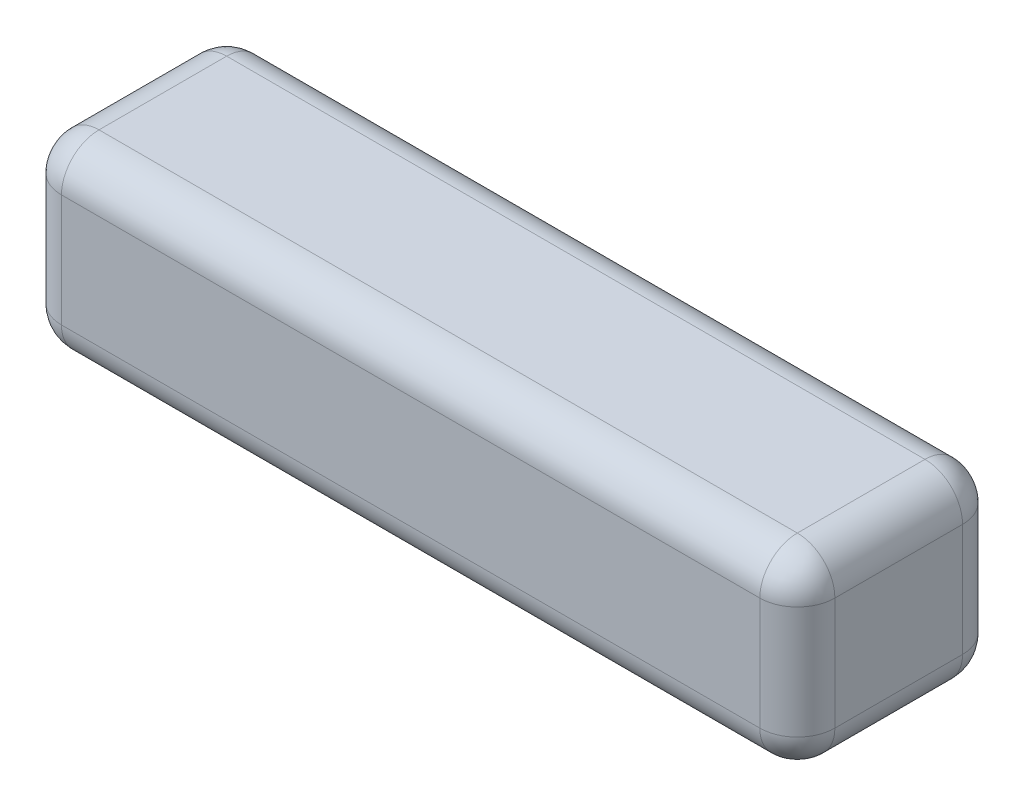
ISO-10303-21;
HEADER;
FILE_DESCRIPTION(('STEP AP214'),'2;1');
FILE_NAME('part.step','',(''),(''),'','','');
FILE_SCHEMA(('AUTOMOTIVE_DESIGN { 1 0 10303 214 1 1 1 1 }'));
ENDSEC;
DATA;
#1=APPLICATION_CONTEXT('core data for automotive mechanical design processes');
#2=APPLICATION_PROTOCOL_DEFINITION('international standard','automotive_design',2000,#1);
#3=PRODUCT_CONTEXT('',#1,'mechanical');
#4=PRODUCT('Part','Part','',(#3));
#5=PRODUCT_RELATED_PRODUCT_CATEGORY('part','',(#4));
#6=PRODUCT_DEFINITION_FORMATION('','',#4);
#7=PRODUCT_DEFINITION_CONTEXT('part definition',#1,'design');
#8=PRODUCT_DEFINITION('design','',#6,#7);
#9=PRODUCT_DEFINITION_SHAPE('','',#8);
#10=(LENGTH_UNIT() NAMED_UNIT(*) SI_UNIT(.MILLI.,.METRE.));
#11=(NAMED_UNIT(*) PLANE_ANGLE_UNIT() SI_UNIT($,.RADIAN.));
#12=(NAMED_UNIT(*) SI_UNIT($,.STERADIAN.) SOLID_ANGLE_UNIT());
#13=UNCERTAINTY_MEASURE_WITH_UNIT(LENGTH_MEASURE(1.E-05),#10,'distance_accuracy_value','');
#14=(GEOMETRIC_REPRESENTATION_CONTEXT(3) GLOBAL_UNCERTAINTY_ASSIGNED_CONTEXT((#13)) GLOBAL_UNIT_ASSIGNED_CONTEXT((#10,
#11,#12)) REPRESENTATION_CONTEXT('',''));
#15=CARTESIAN_POINT('',(0.,0.,0.));
#16=DIRECTION('',(0.,0.,1.));
#17=DIRECTION('',(1.,0.,0.));
#18=AXIS2_PLACEMENT_3D('',#15,#16,#17);
#19=CARTESIAN_POINT('',(51.5000000000001,25.,-13.5));
#20=DIRECTION('',(-1.,0.,0.));
#21=DIRECTION('',(0.,0.,1.));
#22=AXIS2_PLACEMENT_3D('',#19,#20,#21);
#23=PLANE('',#22);
#24=DIRECTION('',(0.,0.,-1.));
#25=VECTOR('',#24,1.);
#26=CARTESIAN_POINT('',(51.5000000000001,20.,13.5));
#27=LINE('',#26,#25);
#28=CARTESIAN_POINT('',(51.5000000000001,20.,-8.5));
#29=VERTEX_POINT('',#28);
#30=CARTESIAN_POINT('',(51.5000000000001,20.,8.5));
#31=VERTEX_POINT('',#30);
#32=EDGE_CURVE('E125',#29,#31,#27,.F.);
#33=ORIENTED_EDGE('',*,*,#32,.T.);
#34=DIRECTION('',(0.,-1.,0.));
#35=VECTOR('',#34,1.);
#36=CARTESIAN_POINT('',(51.5000000000001,25.,8.5));
#37=LINE('',#36,#35);
#38=CARTESIAN_POINT('',(51.5000000000001,5.,8.5));
#39=VERTEX_POINT('',#38);
#40=EDGE_CURVE('E162',#31,#39,#37,.T.);
#41=ORIENTED_EDGE('',*,*,#40,.T.);
#42=DIRECTION('',(0.,0.,-1.));
#43=VECTOR('',#42,1.);
#44=CARTESIAN_POINT('',(51.5000000000001,5.,-13.5));
#45=LINE('',#44,#43);
#46=CARTESIAN_POINT('',(51.5000000000001,5.,-8.5));
#47=VERTEX_POINT('',#46);
#48=EDGE_CURVE('E128',#39,#47,#45,.T.);
#49=ORIENTED_EDGE('',*,*,#48,.T.);
#50=DIRECTION('',(0.,-1.,0.));
#51=VECTOR('',#50,1.);
#52=CARTESIAN_POINT('',(51.5000000000001,25.,-8.5));
#53=LINE('',#52,#51);
#54=EDGE_CURVE('E121',#47,#29,#53,.F.);
#55=ORIENTED_EDGE('',*,*,#54,.T.);
#56=EDGE_LOOP('',(#33,#41,#49,#55));
#57=FACE_BOUND('',#56,.T.);
#58=ADVANCED_FACE('F33',(#57),#23,.F.);
#59=CARTESIAN_POINT('',(-51.4999999999999,25.,-13.5));
#60=DIRECTION('',(0.,0.,1.));
#61=DIRECTION('',(1.,0.,0.));
#62=AXIS2_PLACEMENT_3D('',#59,#60,#61);
#63=PLANE('',#62);
#64=DIRECTION('',(0.,-1.,0.));
#65=VECTOR('',#64,1.);
#66=CARTESIAN_POINT('',(46.5000000000001,25.,-13.5));
#67=LINE('',#66,#65);
#68=CARTESIAN_POINT('',(46.5000000000001,20.,-13.5));
#69=VERTEX_POINT('',#68);
#70=CARTESIAN_POINT('',(46.5000000000001,5.,-13.5));
#71=VERTEX_POINT('',#70);
#72=EDGE_CURVE('E139',#69,#71,#67,.T.);
#73=ORIENTED_EDGE('',*,*,#72,.T.);
#74=DIRECTION('',(-1.,0.,0.));
#75=VECTOR('',#74,1.);
#76=CARTESIAN_POINT('',(-51.4999999999999,5.,-13.5));
#77=LINE('',#76,#75);
#78=CARTESIAN_POINT('',(-46.4999999999999,5.,-13.5));
#79=VERTEX_POINT('',#78);
#80=EDGE_CURVE('E196',#71,#79,#77,.T.);
#81=ORIENTED_EDGE('',*,*,#80,.T.);
#82=DIRECTION('',(0.,-1.,0.));
#83=VECTOR('',#82,1.);
#84=CARTESIAN_POINT('',(-46.4999999999999,25.,-13.5));
#85=LINE('',#84,#83);
#86=CARTESIAN_POINT('',(-46.4999999999999,20.,-13.5));
#87=VERTEX_POINT('',#86);
#88=EDGE_CURVE('E193',#79,#87,#85,.F.);
#89=ORIENTED_EDGE('',*,*,#88,.T.);
#90=DIRECTION('',(-1.,0.,0.));
#91=VECTOR('',#90,1.);
#92=CARTESIAN_POINT('',(51.5000000000001,20.,-13.5));
#93=LINE('',#92,#91);
#94=EDGE_CURVE('E191',#87,#69,#93,.F.);
#95=ORIENTED_EDGE('',*,*,#94,.T.);
#96=EDGE_LOOP('',(#73,#81,#89,#95));
#97=FACE_BOUND('',#96,.T.);
#98=ADVANCED_FACE('F311',(#97),#63,.F.);
#99=CARTESIAN_POINT('',(-51.4999999999999,25.,-13.5));
#100=DIRECTION('',(1.,0.,0.));
#101=DIRECTION('',(0.,0.,-1.));
#102=AXIS2_PLACEMENT_3D('',#99,#100,#101);
#103=PLANE('',#102);
#104=DIRECTION('',(0.,0.,1.));
#105=VECTOR('',#104,1.);
#106=CARTESIAN_POINT('',(-51.4999999999999,5.,-13.5));
#107=LINE('',#106,#105);
#108=CARTESIAN_POINT('',(-51.4999999999999,5.,-8.5));
#109=VERTEX_POINT('',#108);
#110=CARTESIAN_POINT('',(-51.4999999999999,5.,8.5));
#111=VERTEX_POINT('',#110);
#112=EDGE_CURVE('E177',#109,#111,#107,.T.);
#113=ORIENTED_EDGE('',*,*,#112,.T.);
#114=DIRECTION('',(0.,-1.,0.));
#115=VECTOR('',#114,1.);
#116=CARTESIAN_POINT('',(-51.4999999999999,25.,8.5));
#117=LINE('',#116,#115);
#118=CARTESIAN_POINT('',(-51.4999999999999,20.,8.5));
#119=VERTEX_POINT('',#118);
#120=EDGE_CURVE('E179',#111,#119,#117,.F.);
#121=ORIENTED_EDGE('',*,*,#120,.T.);
#122=DIRECTION('',(0.,0.,1.));
#123=VECTOR('',#122,1.);
#124=CARTESIAN_POINT('',(-51.4999999999999,20.,-13.5));
#125=LINE('',#124,#123);
#126=CARTESIAN_POINT('',(-51.4999999999999,20.,-8.5));
#127=VERTEX_POINT('',#126);
#128=EDGE_CURVE('E173',#119,#127,#125,.F.);
#129=ORIENTED_EDGE('',*,*,#128,.T.);
#130=DIRECTION('',(0.,-1.,0.));
#131=VECTOR('',#130,1.);
#132=CARTESIAN_POINT('',(-51.4999999999999,25.,-8.5));
#133=LINE('',#132,#131);
#134=EDGE_CURVE('E175',#127,#109,#133,.T.);
#135=ORIENTED_EDGE('',*,*,#134,.T.);
#136=EDGE_LOOP('',(#113,#121,#129,#135));
#137=FACE_BOUND('',#136,.T.);
#138=ADVANCED_FACE('F291',(#137),#103,.F.);
#139=CARTESIAN_POINT('',(-51.4999999999999,25.,13.5));
#140=DIRECTION('',(0.,0.,-1.));
#141=DIRECTION('',(-1.,0.,0.));
#142=AXIS2_PLACEMENT_3D('',#139,#140,#141);
#143=PLANE('',#142);
#144=DIRECTION('',(0.,-1.,0.));
#145=VECTOR('',#144,1.);
#146=CARTESIAN_POINT('',(-46.4999999999999,25.,13.5));
#147=LINE('',#146,#145);
#148=CARTESIAN_POINT('',(-46.4999999999999,20.,13.5));
#149=VERTEX_POINT('',#148);
#150=CARTESIAN_POINT('',(-46.4999999999999,5.,13.5));
#151=VERTEX_POINT('',#150);
#152=EDGE_CURVE('E166',#149,#151,#147,.T.);
#153=ORIENTED_EDGE('',*,*,#152,.T.);
#154=DIRECTION('',(1.,0.,0.));
#155=VECTOR('',#154,1.);
#156=CARTESIAN_POINT('',(-51.4999999999999,5.,13.5));
#157=LINE('',#156,#155);
#158=CARTESIAN_POINT('',(46.5000000000001,5.,13.5));
#159=VERTEX_POINT('',#158);
#160=EDGE_CURVE('E171',#151,#159,#157,.T.);
#161=ORIENTED_EDGE('',*,*,#160,.T.);
#162=DIRECTION('',(0.,-1.,0.));
#163=VECTOR('',#162,1.);
#164=CARTESIAN_POINT('',(46.5000000000001,25.,13.5));
#165=LINE('',#164,#163);
#166=CARTESIAN_POINT('',(46.5000000000001,20.,13.5));
#167=VERTEX_POINT('',#166);
#168=EDGE_CURVE('E168',#159,#167,#165,.F.);
#169=ORIENTED_EDGE('',*,*,#168,.T.);
#170=DIRECTION('',(1.,0.,0.));
#171=VECTOR('',#170,1.);
#172=CARTESIAN_POINT('',(-51.4999999999999,20.,13.5));
#173=LINE('',#172,#171);
#174=EDGE_CURVE('E164',#167,#149,#173,.F.);
#175=ORIENTED_EDGE('',*,*,#174,.T.);
#176=EDGE_LOOP('',(#153,#161,#169,#175));
#177=FACE_BOUND('',#176,.T.);
#178=ADVANCED_FACE('F282',(#177),#143,.F.);
#179=CARTESIAN_POINT('',(0.,25.,0.));
#180=DIRECTION('',(0.,1.,0.));
#181=DIRECTION('',(0.,0.,1.));
#182=AXIS2_PLACEMENT_3D('',#179,#180,#181);
#183=PLANE('',#182);
#184=DIRECTION('',(0.,0.,1.));
#185=VECTOR('',#184,1.);
#186=CARTESIAN_POINT('',(-46.4999999999999,25.,13.5));
#187=LINE('',#186,#185);
#188=CARTESIAN_POINT('',(-46.4999999999999,25.,-8.5));
#189=VERTEX_POINT('',#188);
#190=CARTESIAN_POINT('',(-46.4999999999999,25.,8.5));
#191=VERTEX_POINT('',#190);
#192=EDGE_CURVE('E42',#189,#191,#187,.T.);
#193=ORIENTED_EDGE('',*,*,#192,.T.);
#194=DIRECTION('',(1.,0.,0.));
#195=VECTOR('',#194,1.);
#196=CARTESIAN_POINT('',(51.5000000000001,25.,8.5));
#197=LINE('',#196,#195);
#198=CARTESIAN_POINT('',(46.5000000000001,25.,8.5));
#199=VERTEX_POINT('',#198);
#200=EDGE_CURVE('E11',#191,#199,#197,.T.);
#201=ORIENTED_EDGE('',*,*,#200,.T.);
#202=DIRECTION('',(0.,0.,-1.));
#203=VECTOR('',#202,1.);
#204=CARTESIAN_POINT('',(46.5000000000001,25.,-13.5));
#205=LINE('',#204,#203);
#206=CARTESIAN_POINT('',(46.5000000000001,25.,-8.5));
#207=VERTEX_POINT('',#206);
#208=EDGE_CURVE('E198',#199,#207,#205,.T.);
#209=ORIENTED_EDGE('',*,*,#208,.T.);
#210=DIRECTION('',(-1.,0.,0.));
#211=VECTOR('',#210,1.);
#212=CARTESIAN_POINT('',(-51.4999999999999,25.,-8.5));
#213=LINE('',#212,#211);
#214=EDGE_CURVE('E53',#207,#189,#213,.T.);
#215=ORIENTED_EDGE('',*,*,#214,.T.);
#216=EDGE_LOOP('',(#193,#201,#209,#215));
#217=FACE_BOUND('',#216,.T.);
#218=ADVANCED_FACE('F307',(#217),#183,.T.);
#219=CARTESIAN_POINT('',(0.,0.,0.));
#220=DIRECTION('',(0.,1.,0.));
#221=DIRECTION('',(0.,0.,1.));
#222=AXIS2_PLACEMENT_3D('',#219,#220,#221);
#223=PLANE('',#222);
#224=DIRECTION('',(1.,0.,0.));
#225=VECTOR('',#224,1.);
#226=CARTESIAN_POINT('',(0.,0.,8.5));
#227=LINE('',#226,#225);
#228=CARTESIAN_POINT('',(46.5000000000001,0.,8.5));
#229=VERTEX_POINT('',#228);
#230=CARTESIAN_POINT('',(-46.4999999999999,0.,8.5));
#231=VERTEX_POINT('',#230);
#232=EDGE_CURVE('E186',#229,#231,#227,.F.);
#233=ORIENTED_EDGE('',*,*,#232,.T.);
#234=DIRECTION('',(0.,0.,1.));
#235=VECTOR('',#234,1.);
#236=CARTESIAN_POINT('',(-46.4999999999999,0.,0.));
#237=LINE('',#236,#235);
#238=CARTESIAN_POINT('',(-46.4999999999999,0.,-8.5));
#239=VERTEX_POINT('',#238);
#240=EDGE_CURVE('E188',#231,#239,#237,.F.);
#241=ORIENTED_EDGE('',*,*,#240,.T.);
#242=DIRECTION('',(-1.,0.,0.));
#243=VECTOR('',#242,1.);
#244=CARTESIAN_POINT('',(0.,0.,-8.5));
#245=LINE('',#244,#243);
#246=CARTESIAN_POINT('',(46.5000000000001,0.,-8.5));
#247=VERTEX_POINT('',#246);
#248=EDGE_CURVE('E182',#239,#247,#245,.F.);
#249=ORIENTED_EDGE('',*,*,#248,.T.);
#250=DIRECTION('',(0.,0.,-1.));
#251=VECTOR('',#250,1.);
#252=CARTESIAN_POINT('',(46.5000000000001,0.,0.));
#253=LINE('',#252,#251);
#254=EDGE_CURVE('E184',#247,#229,#253,.F.);
#255=ORIENTED_EDGE('',*,*,#254,.T.);
#256=EDGE_LOOP('',(#233,#241,#249,#255));
#257=FACE_BOUND('',#256,.T.);
#258=ADVANCED_FACE('F264',(#257),#223,.F.);
#259=CARTESIAN_POINT('',(-46.4999999999999,25.,-8.5));
#260=DIRECTION('',(0.,-1.,0.));
#261=DIRECTION('',(0.,0.,-1.));
#262=AXIS2_PLACEMENT_3D('',#259,#260,#261);
#263=CYLINDRICAL_SURFACE('',#262,5.);
#264=CARTESIAN_POINT('',(-46.4999999999999,20.,-8.5));
#265=DIRECTION('',(0.,1.,0.));
#266=DIRECTION('',(0.,0.,1.));
#267=AXIS2_PLACEMENT_3D('',#264,#265,#266);
#268=CIRCLE('',#267,5.);
#269=EDGE_CURVE('E37',#87,#127,#268,.T.);
#270=ORIENTED_EDGE('',*,*,#269,.F.);
#271=ORIENTED_EDGE('',*,*,#88,.F.);
#272=CARTESIAN_POINT('',(-46.4999999999999,5.,-8.5));
#273=DIRECTION('',(0.,-1.,0.));
#274=DIRECTION('',(0.,0.,-1.));
#275=AXIS2_PLACEMENT_3D('',#272,#273,#274);
#276=CIRCLE('',#275,5.);
#277=EDGE_CURVE('E159',#109,#79,#276,.T.);
#278=ORIENTED_EDGE('',*,*,#277,.F.);
#279=ORIENTED_EDGE('',*,*,#134,.F.);
#280=EDGE_LOOP('',(#270,#271,#278,#279));
#281=FACE_BOUND('',#280,.T.);
#282=ADVANCED_FACE('F35',(#281),#263,.T.);
#283=CARTESIAN_POINT('',(-46.4999999999999,20.,-8.5));
#284=DIRECTION('',(-1.,0.,0.));
#285=DIRECTION('',(0.,0.,1.));
#286=AXIS2_PLACEMENT_3D('',#283,#284,#285);
#287=SPHERICAL_SURFACE('',#286,5.);
#288=CARTESIAN_POINT('',(-46.4999999999999,20.,-8.5));
#289=DIRECTION('',(-1.,0.,0.));
#290=DIRECTION('',(0.,0.,1.));
#291=AXIS2_PLACEMENT_3D('',#288,#289,#290);
#292=CIRCLE('',#291,5.);
#293=EDGE_CURVE('E244',#87,#189,#292,.F.);
#294=ORIENTED_EDGE('',*,*,#293,.F.);
#295=ORIENTED_EDGE('',*,*,#269,.T.);
#296=CARTESIAN_POINT('',(-46.4999999999999,20.,-8.5));
#297=DIRECTION('',(0.,0.,-1.));
#298=DIRECTION('',(-1.,0.,0.));
#299=AXIS2_PLACEMENT_3D('',#296,#297,#298);
#300=CIRCLE('',#299,5.);
#301=EDGE_CURVE('E246',#189,#127,#300,.F.);
#302=ORIENTED_EDGE('',*,*,#301,.F.);
#303=EDGE_LOOP('',(#294,#295,#302));
#304=FACE_BOUND('',#303,.T.);
#305=ADVANCED_FACE('F296',(#304),#287,.T.);
#306=CARTESIAN_POINT('',(-46.4999999999999,5.,-8.5));
#307=DIRECTION('',(0.,0.,-1.));
#308=DIRECTION('',(0.,1.,0.));
#309=AXIS2_PLACEMENT_3D('',#306,#307,#308);
#310=SPHERICAL_SURFACE('',#309,5.);
#311=CARTESIAN_POINT('',(-46.4999999999999,5.,-8.5));
#312=DIRECTION('',(0.,0.,-1.));
#313=DIRECTION('',(-1.,0.,0.));
#314=AXIS2_PLACEMENT_3D('',#311,#312,#313);
#315=CIRCLE('',#314,5.);
#316=EDGE_CURVE('E238',#109,#239,#315,.F.);
#317=ORIENTED_EDGE('',*,*,#316,.F.);
#318=ORIENTED_EDGE('',*,*,#277,.T.);
#319=CARTESIAN_POINT('',(-46.4999999999999,5.,-8.5));
#320=DIRECTION('',(-1.,0.,0.));
#321=DIRECTION('',(0.,0.,1.));
#322=AXIS2_PLACEMENT_3D('',#319,#320,#321);
#323=CIRCLE('',#322,5.);
#324=EDGE_CURVE('E241',#239,#79,#323,.F.);
#325=ORIENTED_EDGE('',*,*,#324,.F.);
#326=EDGE_LOOP('',(#317,#318,#325));
#327=FACE_BOUND('',#326,.T.);
#328=ADVANCED_FACE('F253',(#327),#310,.T.);
#329=CARTESIAN_POINT('',(-46.4999999999999,20.,0.));
#330=DIRECTION('',(0.,0.,-1.));
#331=DIRECTION('',(-1.,0.,0.));
#332=AXIS2_PLACEMENT_3D('',#329,#330,#331);
#333=CYLINDRICAL_SURFACE('',#332,5.);
#334=ORIENTED_EDGE('',*,*,#301,.T.);
#335=ORIENTED_EDGE('',*,*,#128,.F.);
#336=CARTESIAN_POINT('',(-46.4999999999999,20.,8.5));
#337=DIRECTION('',(0.,0.,1.));
#338=DIRECTION('',(1.,0.,0.));
#339=AXIS2_PLACEMENT_3D('',#336,#337,#338);
#340=CIRCLE('',#339,5.);
#341=EDGE_CURVE('E233',#191,#119,#340,.T.);
#342=ORIENTED_EDGE('',*,*,#341,.F.);
#343=ORIENTED_EDGE('',*,*,#192,.F.);
#344=EDGE_LOOP('',(#334,#335,#342,#343));
#345=FACE_BOUND('',#344,.T.);
#346=ADVANCED_FACE('F299',(#345),#333,.T.);
#347=CARTESIAN_POINT('',(0.,20.,-8.5));
#348=DIRECTION('',(1.,0.,0.));
#349=DIRECTION('',(0.,0.,-1.));
#350=AXIS2_PLACEMENT_3D('',#347,#348,#349);
#351=CYLINDRICAL_SURFACE('',#350,5.);
#352=ORIENTED_EDGE('',*,*,#293,.T.);
#353=ORIENTED_EDGE('',*,*,#214,.F.);
#354=CARTESIAN_POINT('',(46.5000000000001,20.,-8.5));
#355=DIRECTION('',(1.,0.,0.));
#356=DIRECTION('',(0.,1.,0.));
#357=AXIS2_PLACEMENT_3D('',#354,#355,#356);
#358=CIRCLE('',#357,5.);
#359=EDGE_CURVE('E143',#69,#207,#358,.T.);
#360=ORIENTED_EDGE('',*,*,#359,.F.);
#361=ORIENTED_EDGE('',*,*,#94,.F.);
#362=EDGE_LOOP('',(#352,#353,#360,#361));
#363=FACE_BOUND('',#362,.T.);
#364=ADVANCED_FACE('F309',(#363),#351,.T.);
#365=CARTESIAN_POINT('',(46.5000000000001,25.,-8.5));
#366=DIRECTION('',(0.,-1.,0.));
#367=DIRECTION('',(0.,0.,-1.));
#368=AXIS2_PLACEMENT_3D('',#365,#366,#367);
#369=CYLINDRICAL_SURFACE('',#368,5.);
#370=CARTESIAN_POINT('',(46.5000000000001,5.,-8.5));
#371=DIRECTION('',(0.,-1.,0.));
#372=DIRECTION('',(0.,0.,-1.));
#373=AXIS2_PLACEMENT_3D('',#370,#371,#372);
#374=CIRCLE('',#373,5.);
#375=EDGE_CURVE('E144',#71,#47,#374,.T.);
#376=ORIENTED_EDGE('',*,*,#375,.F.);
#377=ORIENTED_EDGE('',*,*,#72,.F.);
#378=CARTESIAN_POINT('',(46.5000000000001,20.,-8.5));
#379=DIRECTION('',(0.,1.,0.));
#380=DIRECTION('',(0.,0.,1.));
#381=AXIS2_PLACEMENT_3D('',#378,#379,#380);
#382=CIRCLE('',#381,5.);
#383=EDGE_CURVE('E135',#29,#69,#382,.T.);
#384=ORIENTED_EDGE('',*,*,#383,.F.);
#385=ORIENTED_EDGE('',*,*,#54,.F.);
#386=EDGE_LOOP('',(#376,#377,#384,#385));
#387=FACE_BOUND('',#386,.T.);
#388=ADVANCED_FACE('F137',(#387),#369,.T.);
#389=CARTESIAN_POINT('',(-51.4999999999999,5.,-8.5));
#390=DIRECTION('',(-1.,0.,0.));
#391=DIRECTION('',(0.,0.,1.));
#392=AXIS2_PLACEMENT_3D('',#389,#390,#391);
#393=CYLINDRICAL_SURFACE('',#392,5.);
#394=ORIENTED_EDGE('',*,*,#324,.T.);
#395=ORIENTED_EDGE('',*,*,#80,.F.);
#396=CARTESIAN_POINT('',(46.5000000000001,5.,-8.5));
#397=DIRECTION('',(1.,0.,0.));
#398=DIRECTION('',(0.,0.,-1.));
#399=AXIS2_PLACEMENT_3D('',#396,#397,#398);
#400=CIRCLE('',#399,5.);
#401=EDGE_CURVE('E229',#247,#71,#400,.T.);
#402=ORIENTED_EDGE('',*,*,#401,.F.);
#403=ORIENTED_EDGE('',*,*,#248,.F.);
#404=EDGE_LOOP('',(#394,#395,#402,#403));
#405=FACE_BOUND('',#404,.T.);
#406=ADVANCED_FACE('F260',(#405),#393,.T.);
#407=CARTESIAN_POINT('',(-46.4999999999999,5.,-13.5));
#408=DIRECTION('',(0.,0.,1.));
#409=DIRECTION('',(1.,0.,0.));
#410=AXIS2_PLACEMENT_3D('',#407,#408,#409);
#411=CYLINDRICAL_SURFACE('',#410,5.);
#412=ORIENTED_EDGE('',*,*,#316,.T.);
#413=ORIENTED_EDGE('',*,*,#240,.F.);
#414=CARTESIAN_POINT('',(-46.4999999999999,5.,8.5));
#415=DIRECTION('',(0.,0.,1.));
#416=DIRECTION('',(1.,0.,0.));
#417=AXIS2_PLACEMENT_3D('',#414,#415,#416);
#418=CIRCLE('',#417,5.);
#419=EDGE_CURVE('E226',#111,#231,#418,.T.);
#420=ORIENTED_EDGE('',*,*,#419,.F.);
#421=ORIENTED_EDGE('',*,*,#112,.F.);
#422=EDGE_LOOP('',(#412,#413,#420,#421));
#423=FACE_BOUND('',#422,.T.);
#424=ADVANCED_FACE('F270',(#423),#411,.T.);
#425=CARTESIAN_POINT('',(-46.4999999999999,25.,8.5));
#426=DIRECTION('',(0.,-1.,0.));
#427=DIRECTION('',(0.,0.,-1.));
#428=AXIS2_PLACEMENT_3D('',#425,#426,#427);
#429=CYLINDRICAL_SURFACE('',#428,5.);
#430=CARTESIAN_POINT('',(-46.4999999999999,20.,8.5));
#431=DIRECTION('',(0.,1.,0.));
#432=DIRECTION('',(0.,0.,1.));
#433=AXIS2_PLACEMENT_3D('',#430,#431,#432);
#434=CIRCLE('',#433,5.);
#435=EDGE_CURVE('E235',#119,#149,#434,.T.);
#436=ORIENTED_EDGE('',*,*,#435,.F.);
#437=ORIENTED_EDGE('',*,*,#120,.F.);
#438=CARTESIAN_POINT('',(-46.4999999999999,5.,8.5));
#439=DIRECTION('',(0.,-1.,0.));
#440=DIRECTION('',(0.,0.,-1.));
#441=AXIS2_PLACEMENT_3D('',#438,#439,#440);
#442=CIRCLE('',#441,5.);
#443=EDGE_CURVE('E223',#151,#111,#442,.T.);
#444=ORIENTED_EDGE('',*,*,#443,.F.);
#445=ORIENTED_EDGE('',*,*,#152,.F.);
#446=EDGE_LOOP('',(#436,#437,#444,#445));
#447=FACE_BOUND('',#446,.T.);
#448=ADVANCED_FACE('F288',(#447),#429,.T.);
#449=CARTESIAN_POINT('',(-46.4999999999999,20.,8.5));
#450=DIRECTION('',(-1.,0.,0.));
#451=DIRECTION('',(0.,0.,1.));
#452=AXIS2_PLACEMENT_3D('',#449,#450,#451);
#453=SPHERICAL_SURFACE('',#452,5.);
#454=ORIENTED_EDGE('',*,*,#341,.T.);
#455=ORIENTED_EDGE('',*,*,#435,.T.);
#456=CARTESIAN_POINT('',(-46.4999999999999,20.,8.5));
#457=DIRECTION('',(-1.,0.,0.));
#458=DIRECTION('',(0.,0.,1.));
#459=AXIS2_PLACEMENT_3D('',#456,#457,#458);
#460=CIRCLE('',#459,5.);
#461=EDGE_CURVE('E151',#191,#149,#460,.F.);
#462=ORIENTED_EDGE('',*,*,#461,.F.);
#463=EDGE_LOOP('',(#454,#455,#462));
#464=FACE_BOUND('',#463,.T.);
#465=ADVANCED_FACE('F303',(#464),#453,.T.);
#466=CARTESIAN_POINT('',(46.5000000000001,20.,-8.5));
#467=DIRECTION('',(0.,0.,-1.));
#468=DIRECTION('',(-1.,0.,0.));
#469=AXIS2_PLACEMENT_3D('',#466,#467,#468);
#470=SPHERICAL_SURFACE('',#469,5.);
#471=ORIENTED_EDGE('',*,*,#383,.T.);
#472=ORIENTED_EDGE('',*,*,#359,.T.);
#473=CARTESIAN_POINT('',(46.5000000000001,20.,-8.5));
#474=DIRECTION('',(0.,0.,-1.));
#475=DIRECTION('',(-1.,0.,0.));
#476=AXIS2_PLACEMENT_3D('',#473,#474,#475);
#477=CIRCLE('',#476,5.);
#478=EDGE_CURVE('E147',#29,#207,#477,.F.);
#479=ORIENTED_EDGE('',*,*,#478,.F.);
#480=EDGE_LOOP('',(#471,#472,#479));
#481=FACE_BOUND('',#480,.T.);
#482=ADVANCED_FACE('F148',(#481),#470,.T.);
#483=CARTESIAN_POINT('',(46.5000000000001,5.,-8.5));
#484=DIRECTION('',(0.,0.,-1.));
#485=DIRECTION('',(-1.,0.,0.));
#486=AXIS2_PLACEMENT_3D('',#483,#484,#485);
#487=SPHERICAL_SURFACE('',#486,5.);
#488=ORIENTED_EDGE('',*,*,#401,.T.);
#489=ORIENTED_EDGE('',*,*,#375,.T.);
#490=CARTESIAN_POINT('',(46.5000000000001,5.,-8.5));
#491=DIRECTION('',(0.,0.,-1.));
#492=DIRECTION('',(-1.,0.,0.));
#493=AXIS2_PLACEMENT_3D('',#490,#491,#492);
#494=CIRCLE('',#493,5.);
#495=EDGE_CURVE('E152',#247,#47,#494,.F.);
#496=ORIENTED_EDGE('',*,*,#495,.F.);
#497=EDGE_LOOP('',(#488,#489,#496));
#498=FACE_BOUND('',#497,.T.);
#499=ADVANCED_FACE('F346',(#498),#487,.T.);
#500=CARTESIAN_POINT('',(-46.4999999999999,5.,8.5));
#501=DIRECTION('',(-1.,0.,0.));
#502=DIRECTION('',(0.,-1.,0.));
#503=AXIS2_PLACEMENT_3D('',#500,#501,#502);
#504=SPHERICAL_SURFACE('',#503,5.);
#505=ORIENTED_EDGE('',*,*,#443,.T.);
#506=ORIENTED_EDGE('',*,*,#419,.T.);
#507=CARTESIAN_POINT('',(-46.4999999999999,5.,8.5));
#508=DIRECTION('',(-1.,0.,0.));
#509=DIRECTION('',(0.,0.,1.));
#510=AXIS2_PLACEMENT_3D('',#507,#508,#509);
#511=CIRCLE('',#510,5.);
#512=EDGE_CURVE('E216',#151,#231,#511,.F.);
#513=ORIENTED_EDGE('',*,*,#512,.F.);
#514=EDGE_LOOP('',(#505,#506,#513));
#515=FACE_BOUND('',#514,.T.);
#516=ADVANCED_FACE('F273',(#515),#504,.T.);
#517=CARTESIAN_POINT('',(0.,20.,8.5));
#518=DIRECTION('',(-1.,0.,0.));
#519=DIRECTION('',(0.,0.,1.));
#520=AXIS2_PLACEMENT_3D('',#517,#518,#519);
#521=CYLINDRICAL_SURFACE('',#520,5.);
#522=ORIENTED_EDGE('',*,*,#461,.T.);
#523=ORIENTED_EDGE('',*,*,#174,.F.);
#524=CARTESIAN_POINT('',(46.5000000000001,20.,8.5));
#525=DIRECTION('',(1.,0.,0.));
#526=DIRECTION('',(0.,0.,-1.));
#527=AXIS2_PLACEMENT_3D('',#524,#525,#526);
#528=CIRCLE('',#527,5.);
#529=EDGE_CURVE('E213',#199,#167,#528,.T.);
#530=ORIENTED_EDGE('',*,*,#529,.F.);
#531=ORIENTED_EDGE('',*,*,#200,.F.);
#532=EDGE_LOOP('',(#522,#523,#530,#531));
#533=FACE_BOUND('',#532,.T.);
#534=ADVANCED_FACE('F306',(#533),#521,.T.);
#535=CARTESIAN_POINT('',(46.5000000000001,20.,0.));
#536=DIRECTION('',(0.,0.,1.));
#537=DIRECTION('',(1.,0.,0.));
#538=AXIS2_PLACEMENT_3D('',#535,#536,#537);
#539=CYLINDRICAL_SURFACE('',#538,5.);
#540=ORIENTED_EDGE('',*,*,#478,.T.);
#541=ORIENTED_EDGE('',*,*,#208,.F.);
#542=CARTESIAN_POINT('',(46.5000000000001,20.,8.5));
#543=DIRECTION('',(0.,0.,1.));
#544=DIRECTION('',(0.,-1.,0.));
#545=AXIS2_PLACEMENT_3D('',#542,#543,#544);
#546=CIRCLE('',#545,5.);
#547=EDGE_CURVE('E155',#31,#199,#546,.T.);
#548=ORIENTED_EDGE('',*,*,#547,.F.);
#549=ORIENTED_EDGE('',*,*,#32,.F.);
#550=EDGE_LOOP('',(#540,#541,#548,#549));
#551=FACE_BOUND('',#550,.T.);
#552=ADVANCED_FACE('F154',(#551),#539,.T.);
#553=CARTESIAN_POINT('',(46.5000000000001,5.,-13.5));
#554=DIRECTION('',(0.,0.,-1.));
#555=DIRECTION('',(-1.,0.,0.));
#556=AXIS2_PLACEMENT_3D('',#553,#554,#555);
#557=CYLINDRICAL_SURFACE('',#556,5.);
#558=ORIENTED_EDGE('',*,*,#495,.T.);
#559=ORIENTED_EDGE('',*,*,#48,.F.);
#560=CARTESIAN_POINT('',(46.5000000000001,5.,8.5));
#561=DIRECTION('',(0.,0.,1.));
#562=DIRECTION('',(1.,0.,0.));
#563=AXIS2_PLACEMENT_3D('',#560,#561,#562);
#564=CIRCLE('',#563,5.);
#565=EDGE_CURVE('E209',#229,#39,#564,.T.);
#566=ORIENTED_EDGE('',*,*,#565,.F.);
#567=ORIENTED_EDGE('',*,*,#254,.F.);
#568=EDGE_LOOP('',(#558,#559,#566,#567));
#569=FACE_BOUND('',#568,.T.);
#570=ADVANCED_FACE('F336',(#569),#557,.T.);
#571=CARTESIAN_POINT('',(-51.4999999999999,5.,8.5));
#572=DIRECTION('',(1.,0.,0.));
#573=DIRECTION('',(0.,0.,-1.));
#574=AXIS2_PLACEMENT_3D('',#571,#572,#573);
#575=CYLINDRICAL_SURFACE('',#574,5.);
#576=ORIENTED_EDGE('',*,*,#512,.T.);
#577=ORIENTED_EDGE('',*,*,#232,.F.);
#578=CARTESIAN_POINT('',(46.5000000000001,5.,8.5));
#579=DIRECTION('',(1.,0.,0.));
#580=DIRECTION('',(0.,0.,-1.));
#581=AXIS2_PLACEMENT_3D('',#578,#579,#580);
#582=CIRCLE('',#581,5.);
#583=EDGE_CURVE('E206',#159,#229,#582,.T.);
#584=ORIENTED_EDGE('',*,*,#583,.F.);
#585=ORIENTED_EDGE('',*,*,#160,.F.);
#586=EDGE_LOOP('',(#576,#577,#584,#585));
#587=FACE_BOUND('',#586,.T.);
#588=ADVANCED_FACE('F277',(#587),#575,.T.);
#589=CARTESIAN_POINT('',(46.5000000000001,20.,8.5));
#590=DIRECTION('',(0.,1.,0.));
#591=DIRECTION('',(0.,0.,1.));
#592=AXIS2_PLACEMENT_3D('',#589,#590,#591);
#593=SPHERICAL_SURFACE('',#592,5.);
#594=ORIENTED_EDGE('',*,*,#547,.T.);
#595=ORIENTED_EDGE('',*,*,#529,.T.);
#596=CARTESIAN_POINT('',(46.5000000000001,20.,8.5));
#597=DIRECTION('',(0.,1.,0.));
#598=DIRECTION('',(0.,0.,1.));
#599=AXIS2_PLACEMENT_3D('',#596,#597,#598);
#600=CIRCLE('',#599,5.);
#601=EDGE_CURVE('E204',#31,#167,#600,.F.);
#602=ORIENTED_EDGE('',*,*,#601,.F.);
#603=EDGE_LOOP('',(#594,#595,#602));
#604=FACE_BOUND('',#603,.T.);
#605=ADVANCED_FACE('F329',(#604),#593,.T.);
#606=CARTESIAN_POINT('',(46.5000000000001,5.,8.5));
#607=DIRECTION('',(0.,-1.,0.));
#608=DIRECTION('',(0.,0.,-1.));
#609=AXIS2_PLACEMENT_3D('',#606,#607,#608);
#610=SPHERICAL_SURFACE('',#609,5.);
#611=ORIENTED_EDGE('',*,*,#583,.T.);
#612=ORIENTED_EDGE('',*,*,#565,.T.);
#613=CARTESIAN_POINT('',(46.5000000000001,5.,8.5));
#614=DIRECTION('',(0.,-1.,0.));
#615=DIRECTION('',(0.,0.,-1.));
#616=AXIS2_PLACEMENT_3D('',#613,#614,#615);
#617=CIRCLE('',#616,5.);
#618=EDGE_CURVE('E202',#159,#39,#617,.F.);
#619=ORIENTED_EDGE('',*,*,#618,.F.);
#620=EDGE_LOOP('',(#611,#612,#619));
#621=FACE_BOUND('',#620,.T.);
#622=ADVANCED_FACE('F325',(#621),#610,.T.);
#623=CARTESIAN_POINT('',(46.5000000000001,25.,8.5));
#624=DIRECTION('',(0.,-1.,0.));
#625=DIRECTION('',(0.,0.,-1.));
#626=AXIS2_PLACEMENT_3D('',#623,#624,#625);
#627=CYLINDRICAL_SURFACE('',#626,5.);
#628=ORIENTED_EDGE('',*,*,#601,.T.);
#629=ORIENTED_EDGE('',*,*,#168,.F.);
#630=ORIENTED_EDGE('',*,*,#618,.T.);
#631=ORIENTED_EDGE('',*,*,#40,.F.);
#632=EDGE_LOOP('',(#628,#629,#630,#631));
#633=FACE_BOUND('',#632,.T.);
#634=ADVANCED_FACE('F322',(#633),#627,.T.);
#635=CLOSED_SHELL('',(#58,#98,#138,#178,#218,#258,#282,#305,#328,#346,#364,#388,#406,#424,#448,
#465,#482,#499,#516,#534,#552,#570,#588,#605,#622,#634));
#636=MANIFOLD_SOLID_BREP('B2',#635);
#637=ADVANCED_BREP_SHAPE_REPRESENTATION('',(#18,#636),#14);
#638=SHAPE_DEFINITION_REPRESENTATION(#9,#637);
ENDSEC;
END-ISO-10303-21;
